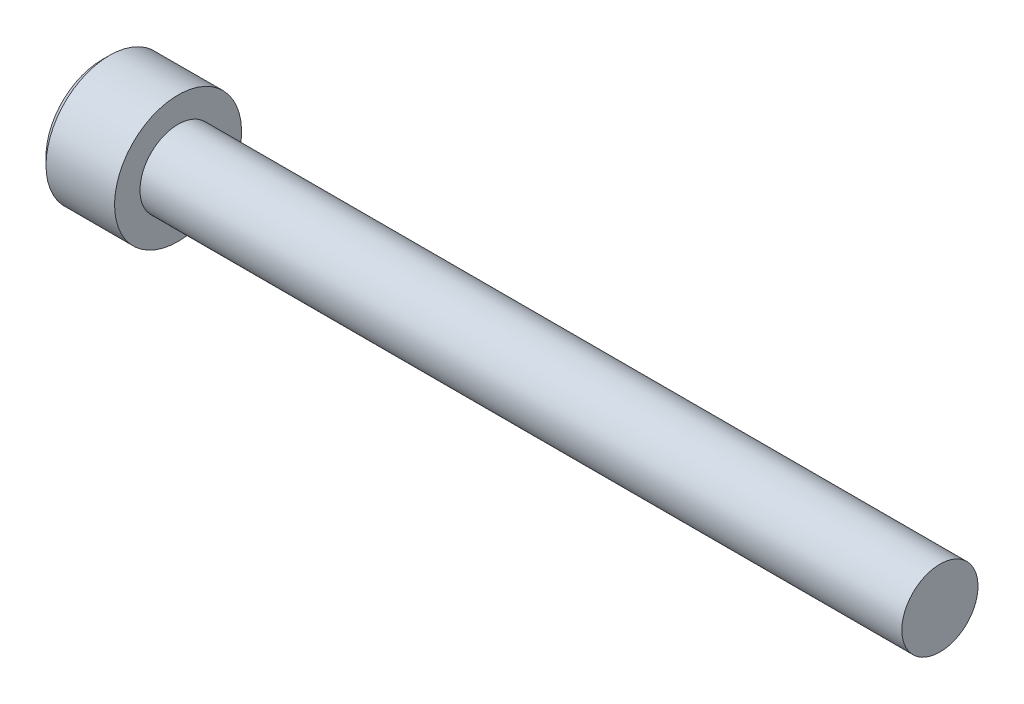
ISO-10303-21;
HEADER;
FILE_DESCRIPTION(('STEP AP214'),'2;1');
FILE_NAME('part.step','',(''),(''),'','','');
FILE_SCHEMA(('AUTOMOTIVE_DESIGN { 1 0 10303 214 1 1 1 1 }'));
ENDSEC;
DATA;
#1=APPLICATION_CONTEXT('core data for automotive mechanical design processes');
#2=APPLICATION_PROTOCOL_DEFINITION('international standard','automotive_design',2000,#1);
#3=PRODUCT_CONTEXT('',#1,'mechanical');
#4=PRODUCT('Part','Part','',(#3));
#5=PRODUCT_RELATED_PRODUCT_CATEGORY('part','',(#4));
#6=PRODUCT_DEFINITION_FORMATION('','',#4);
#7=PRODUCT_DEFINITION_CONTEXT('part definition',#1,'design');
#8=PRODUCT_DEFINITION('design','',#6,#7);
#9=PRODUCT_DEFINITION_SHAPE('','',#8);
#10=(LENGTH_UNIT() NAMED_UNIT(*) SI_UNIT(.MILLI.,.METRE.));
#11=(NAMED_UNIT(*) PLANE_ANGLE_UNIT() SI_UNIT($,.RADIAN.));
#12=(NAMED_UNIT(*) SI_UNIT($,.STERADIAN.) SOLID_ANGLE_UNIT());
#13=UNCERTAINTY_MEASURE_WITH_UNIT(LENGTH_MEASURE(1.E-05),#10,'distance_accuracy_value','');
#14=(GEOMETRIC_REPRESENTATION_CONTEXT(3) GLOBAL_UNCERTAINTY_ASSIGNED_CONTEXT((#13)) GLOBAL_UNIT_ASSIGNED_CONTEXT((#10,
#11,#12)) REPRESENTATION_CONTEXT('',''));
#15=CARTESIAN_POINT('',(0.,0.,0.));
#16=DIRECTION('',(0.,0.,1.));
#17=DIRECTION('',(1.,0.,0.));
#18=AXIS2_PLACEMENT_3D('',#15,#16,#17);
#19=CARTESIAN_POINT('',(-6.,0.,0.));
#20=DIRECTION('',(1.,0.,0.));
#21=DIRECTION('',(0.,1.,0.));
#22=AXIS2_PLACEMENT_3D('',#19,#20,#21);
#23=PLANE('',#22);
#24=CARTESIAN_POINT('',(-6.,0.,0.));
#25=DIRECTION('',(1.,0.,0.));
#26=DIRECTION('',(0.,1.,0.));
#27=AXIS2_PLACEMENT_3D('',#24,#25,#26);
#28=CIRCLE('',#27,4.4);
#29=CARTESIAN_POINT('',(-6.,4.4,0.));
#30=VERTEX_POINT('',#29);
#31=EDGE_CURVE('E50',#30,#30,#28,.F.);
#32=ORIENTED_EDGE('',*,*,#31,.T.);
#33=EDGE_LOOP('',(#32));
#34=FACE_BOUND('',#33,.T.);
#35=DIRECTION('',(0.,-0.5,-0.866025403784439));
#36=VECTOR('',#35,1.);
#37=CARTESIAN_POINT('',(-6.,2.88675134594813,0.));
#38=LINE('',#37,#36);
#39=CARTESIAN_POINT('',(-6.,2.88675134594813,0.));
#40=VERTEX_POINT('',#39);
#41=CARTESIAN_POINT('',(-6.,1.44337567297406,-2.5));
#42=VERTEX_POINT('',#41);
#43=EDGE_CURVE('E156',#40,#42,#38,.T.);
#44=ORIENTED_EDGE('',*,*,#43,.F.);
#45=DIRECTION('',(0.,0.5,-0.866025403784439));
#46=VECTOR('',#45,1.);
#47=CARTESIAN_POINT('',(-6.,1.44337567297407,2.5));
#48=LINE('',#47,#46);
#49=CARTESIAN_POINT('',(-6.,1.44337567297407,2.5));
#50=VERTEX_POINT('',#49);
#51=EDGE_CURVE('E57',#50,#40,#48,.T.);
#52=ORIENTED_EDGE('',*,*,#51,.F.);
#53=DIRECTION('',(0.,1.,0.));
#54=VECTOR('',#53,1.);
#55=CARTESIAN_POINT('',(-6.,-1.44337567297407,2.5));
#56=LINE('',#55,#54);
#57=CARTESIAN_POINT('',(-6.,-1.44337567297407,2.5));
#58=VERTEX_POINT('',#57);
#59=EDGE_CURVE('E127',#58,#50,#56,.T.);
#60=ORIENTED_EDGE('',*,*,#59,.F.);
#61=DIRECTION('',(0.,0.5,0.866025403784439));
#62=VECTOR('',#61,1.);
#63=CARTESIAN_POINT('',(-6.,-2.88675134594813,0.));
#64=LINE('',#63,#62);
#65=CARTESIAN_POINT('',(-6.,-2.88675134594813,0.));
#66=VERTEX_POINT('',#65);
#67=EDGE_CURVE('E162',#66,#58,#64,.T.);
#68=ORIENTED_EDGE('',*,*,#67,.F.);
#69=DIRECTION('',(0.,-0.5,0.866025403784439));
#70=VECTOR('',#69,1.);
#71=CARTESIAN_POINT('',(-6.,-1.44337567297406,-2.5));
#72=LINE('',#71,#70);
#73=CARTESIAN_POINT('',(-6.,-1.44337567297406,-2.5));
#74=VERTEX_POINT('',#73);
#75=EDGE_CURVE('E160',#74,#66,#72,.T.);
#76=ORIENTED_EDGE('',*,*,#75,.F.);
#77=DIRECTION('',(0.,-1.,0.));
#78=VECTOR('',#77,1.);
#79=CARTESIAN_POINT('',(-6.,1.44337567297406,-2.5));
#80=LINE('',#79,#78);
#81=EDGE_CURVE('E158',#42,#74,#80,.T.);
#82=ORIENTED_EDGE('',*,*,#81,.F.);
#83=EDGE_LOOP('',(#44,#52,#60,#68,#76,#82));
#84=FACE_BOUND('',#83,.T.);
#85=ADVANCED_FACE('F42',(#34,#84),#23,.F.);
#86=CARTESIAN_POINT('',(-6.,0.,0.));
#87=DIRECTION('',(-1.,0.,0.));
#88=DIRECTION('',(0.,-1.,0.));
#89=AXIS2_PLACEMENT_3D('',#86,#87,#88);
#90=CYLINDRICAL_SURFACE('',#89,5.);
#91=CARTESIAN_POINT('',(-5.4,0.,0.));
#92=DIRECTION('',(1.,0.,0.));
#93=DIRECTION('',(0.,1.,0.));
#94=AXIS2_PLACEMENT_3D('',#91,#92,#93);
#95=CIRCLE('',#94,5.);
#96=CARTESIAN_POINT('',(-5.4,5.,0.));
#97=VERTEX_POINT('',#96);
#98=EDGE_CURVE('E11',#97,#97,#95,.T.);
#99=ORIENTED_EDGE('',*,*,#98,.T.);
#100=EDGE_LOOP('',(#99));
#101=FACE_BOUND('',#100,.T.);
#102=CARTESIAN_POINT('',(0.,0.,0.));
#103=DIRECTION('',(-1.,0.,0.));
#104=DIRECTION('',(0.,-1.,0.));
#105=AXIS2_PLACEMENT_3D('',#102,#103,#104);
#106=CIRCLE('',#105,5.);
#107=CARTESIAN_POINT('',(0.,-5.,0.));
#108=VERTEX_POINT('',#107);
#109=EDGE_CURVE('E190',#108,#108,#106,.T.);
#110=ORIENTED_EDGE('',*,*,#109,.T.);
#111=EDGE_LOOP('',(#110));
#112=FACE_BOUND('',#111,.T.);
#113=ADVANCED_FACE('F211',(#101,#112),#90,.T.);
#114=CARTESIAN_POINT('',(0.,5.,0.));
#115=DIRECTION('',(-1.,0.,0.));
#116=DIRECTION('',(0.,-1.,0.));
#117=AXIS2_PLACEMENT_3D('',#114,#115,#116);
#118=PLANE('',#117);
#119=ORIENTED_EDGE('',*,*,#109,.F.);
#120=EDGE_LOOP('',(#119));
#121=FACE_BOUND('',#120,.T.);
#122=CARTESIAN_POINT('',(0.,0.,0.));
#123=DIRECTION('',(-1.,0.,0.));
#124=DIRECTION('',(0.,-1.,0.));
#125=AXIS2_PLACEMENT_3D('',#122,#123,#124);
#126=CIRCLE('',#125,3.);
#127=CARTESIAN_POINT('',(0.,-3.,0.));
#128=VERTEX_POINT('',#127);
#129=EDGE_CURVE('E187',#128,#128,#126,.T.);
#130=ORIENTED_EDGE('',*,*,#129,.T.);
#131=EDGE_LOOP('',(#130));
#132=FACE_BOUND('',#131,.T.);
#133=ADVANCED_FACE('F215',(#121,#132),#118,.F.);
#134=CARTESIAN_POINT('',(-6.,0.,0.));
#135=DIRECTION('',(-1.,0.,0.));
#136=DIRECTION('',(0.,-1.,0.));
#137=AXIS2_PLACEMENT_3D('',#134,#135,#136);
#138=CYLINDRICAL_SURFACE('',#137,3.);
#139=ORIENTED_EDGE('',*,*,#129,.F.);
#140=EDGE_LOOP('',(#139));
#141=FACE_BOUND('',#140,.T.);
#142=CARTESIAN_POINT('',(60.,0.,0.));
#143=DIRECTION('',(-1.,0.,0.));
#144=DIRECTION('',(0.,-1.,0.));
#145=AXIS2_PLACEMENT_3D('',#142,#143,#144);
#146=CIRCLE('',#145,3.);
#147=CARTESIAN_POINT('',(60.,-2.99999999999999,0.));
#148=VERTEX_POINT('',#147);
#149=EDGE_CURVE('E183',#148,#148,#146,.T.);
#150=ORIENTED_EDGE('',*,*,#149,.T.);
#151=EDGE_LOOP('',(#150));
#152=FACE_BOUND('',#151,.T.);
#153=ADVANCED_FACE('F206',(#141,#152),#138,.T.);
#154=CARTESIAN_POINT('',(60.,3.,0.));
#155=DIRECTION('',(-1.,0.,0.));
#156=DIRECTION('',(0.,-1.,0.));
#157=AXIS2_PLACEMENT_3D('',#154,#155,#156);
#158=PLANE('',#157);
#159=ORIENTED_EDGE('',*,*,#149,.F.);
#160=EDGE_LOOP('',(#159));
#161=FACE_BOUND('',#160,.T.);
#162=ADVANCED_FACE('F198',(#161),#158,.F.);
#163=CARTESIAN_POINT('',(-6.,0.,0.));
#164=DIRECTION('',(1.,0.,0.));
#165=DIRECTION('',(0.,1.,0.));
#166=AXIS2_PLACEMENT_3D('',#163,#164,#165);
#167=CONICAL_SURFACE('',#166,4.4,0.785398163397446);
#168=ORIENTED_EDGE('',*,*,#98,.F.);
#169=EDGE_LOOP('',(#168));
#170=FACE_BOUND('',#169,.T.);
#171=ORIENTED_EDGE('',*,*,#31,.F.);
#172=EDGE_LOOP('',(#171));
#173=FACE_BOUND('',#172,.T.);
#174=ADVANCED_FACE('F44',(#170,#173),#167,.T.);
#175=CARTESIAN_POINT('',(-3.,1.44337567297407,2.5));
#176=DIRECTION('',(0.,0.866025403784439,0.5));
#177=DIRECTION('',(0.,-0.5,0.866025403784439));
#178=AXIS2_PLACEMENT_3D('',#175,#176,#177);
#179=PLANE('',#178);
#180=DIRECTION('',(0.,0.5,-0.866025403784439));
#181=VECTOR('',#180,1.);
#182=CARTESIAN_POINT('',(-3.,1.44337567297407,2.5));
#183=LINE('',#182,#181);
#184=CARTESIAN_POINT('',(-3.,1.44337567297407,2.5));
#185=VERTEX_POINT('',#184);
#186=CARTESIAN_POINT('',(-3.,2.1650635094611,1.25));
#187=VERTEX_POINT('',#186);
#188=EDGE_CURVE('E126',#185,#187,#183,.T.);
#189=ORIENTED_EDGE('',*,*,#188,.F.);
#190=DIRECTION('',(-1.,0.,0.));
#191=VECTOR('',#190,1.);
#192=CARTESIAN_POINT('',(-3.,1.44337567297407,2.5));
#193=LINE('',#192,#191);
#194=EDGE_CURVE('E166',#185,#50,#193,.T.);
#195=ORIENTED_EDGE('',*,*,#194,.T.);
#196=ORIENTED_EDGE('',*,*,#51,.T.);
#197=DIRECTION('',(-1.,0.,0.));
#198=VECTOR('',#197,1.);
#199=CARTESIAN_POINT('',(-3.,2.88675134594813,0.));
#200=LINE('',#199,#198);
#201=CARTESIAN_POINT('',(-3.,2.88675134594813,0.));
#202=VERTEX_POINT('',#201);
#203=EDGE_CURVE('E129',#202,#40,#200,.T.);
#204=ORIENTED_EDGE('',*,*,#203,.F.);
#205=EDGE_CURVE('E118',#187,#202,#183,.T.);
#206=ORIENTED_EDGE('',*,*,#205,.F.);
#207=EDGE_LOOP('',(#189,#195,#196,#204,#206));
#208=FACE_BOUND('',#207,.T.);
#209=ADVANCED_FACE('F130',(#208),#179,.F.);
#210=CARTESIAN_POINT('',(-3.,-1.44337567297407,2.5));
#211=DIRECTION('',(0.,0.,1.));
#212=DIRECTION('',(0.,-1.,0.));
#213=AXIS2_PLACEMENT_3D('',#210,#211,#212);
#214=PLANE('',#213);
#215=DIRECTION('',(0.,1.,0.));
#216=VECTOR('',#215,1.);
#217=CARTESIAN_POINT('',(-3.,-1.44337567297407,2.5));
#218=LINE('',#217,#216);
#219=CARTESIAN_POINT('',(-3.,-1.44337567297407,2.5));
#220=VERTEX_POINT('',#219);
#221=CARTESIAN_POINT('',(-3.,0.,2.5));
#222=VERTEX_POINT('',#221);
#223=EDGE_CURVE('E65',#220,#222,#218,.T.);
#224=ORIENTED_EDGE('',*,*,#223,.F.);
#225=DIRECTION('',(-1.,0.,0.));
#226=VECTOR('',#225,1.);
#227=CARTESIAN_POINT('',(-3.,-1.44337567297407,2.5));
#228=LINE('',#227,#226);
#229=EDGE_CURVE('E169',#220,#58,#228,.T.);
#230=ORIENTED_EDGE('',*,*,#229,.T.);
#231=ORIENTED_EDGE('',*,*,#59,.T.);
#232=ORIENTED_EDGE('',*,*,#194,.F.);
#233=EDGE_CURVE('E153',#222,#185,#218,.T.);
#234=ORIENTED_EDGE('',*,*,#233,.F.);
#235=EDGE_LOOP('',(#224,#230,#231,#232,#234));
#236=FACE_BOUND('',#235,.T.);
#237=ADVANCED_FACE('F204',(#236),#214,.F.);
#238=CARTESIAN_POINT('',(-3.,-2.88675134594813,0.));
#239=DIRECTION('',(0.,-0.866025403784439,0.5));
#240=DIRECTION('',(0.,-0.5,-0.866025403784439));
#241=AXIS2_PLACEMENT_3D('',#238,#239,#240);
#242=PLANE('',#241);
#243=DIRECTION('',(0.,0.5,0.866025403784439));
#244=VECTOR('',#243,1.);
#245=CARTESIAN_POINT('',(-3.,-2.88675134594813,0.));
#246=LINE('',#245,#244);
#247=CARTESIAN_POINT('',(-3.,-2.88675134594813,0.));
#248=VERTEX_POINT('',#247);
#249=CARTESIAN_POINT('',(-3.,-2.1650635094611,1.25));
#250=VERTEX_POINT('',#249);
#251=EDGE_CURVE('E150',#248,#250,#246,.T.);
#252=ORIENTED_EDGE('',*,*,#251,.F.);
#253=DIRECTION('',(-1.,0.,0.));
#254=VECTOR('',#253,1.);
#255=CARTESIAN_POINT('',(-3.,-2.88675134594813,0.));
#256=LINE('',#255,#254);
#257=EDGE_CURVE('E172',#248,#66,#256,.T.);
#258=ORIENTED_EDGE('',*,*,#257,.T.);
#259=ORIENTED_EDGE('',*,*,#67,.T.);
#260=ORIENTED_EDGE('',*,*,#229,.F.);
#261=EDGE_CURVE('E149',#250,#220,#246,.T.);
#262=ORIENTED_EDGE('',*,*,#261,.F.);
#263=EDGE_LOOP('',(#252,#258,#259,#260,#262));
#264=FACE_BOUND('',#263,.T.);
#265=ADVANCED_FACE('F240',(#264),#242,.F.);
#266=CARTESIAN_POINT('',(-3.,-1.44337567297406,-2.5));
#267=DIRECTION('',(0.,-0.866025403784439,-0.5));
#268=DIRECTION('',(0.,0.5,-0.866025403784439));
#269=AXIS2_PLACEMENT_3D('',#266,#267,#268);
#270=PLANE('',#269);
#271=DIRECTION('',(0.,-0.5,0.866025403784439));
#272=VECTOR('',#271,1.);
#273=CARTESIAN_POINT('',(-3.,-1.44337567297406,-2.5));
#274=LINE('',#273,#272);
#275=CARTESIAN_POINT('',(-3.,-1.44337567297406,-2.5));
#276=VERTEX_POINT('',#275);
#277=CARTESIAN_POINT('',(-3.,-2.1650635094611,-1.25));
#278=VERTEX_POINT('',#277);
#279=EDGE_CURVE('E146',#276,#278,#274,.T.);
#280=ORIENTED_EDGE('',*,*,#279,.F.);
#281=DIRECTION('',(-1.,0.,0.));
#282=VECTOR('',#281,1.);
#283=CARTESIAN_POINT('',(-3.,-1.44337567297406,-2.5));
#284=LINE('',#283,#282);
#285=EDGE_CURVE('E175',#276,#74,#284,.T.);
#286=ORIENTED_EDGE('',*,*,#285,.T.);
#287=ORIENTED_EDGE('',*,*,#75,.T.);
#288=ORIENTED_EDGE('',*,*,#257,.F.);
#289=EDGE_CURVE('E145',#278,#248,#274,.T.);
#290=ORIENTED_EDGE('',*,*,#289,.F.);
#291=EDGE_LOOP('',(#280,#286,#287,#288,#290));
#292=FACE_BOUND('',#291,.T.);
#293=ADVANCED_FACE('F236',(#292),#270,.F.);
#294=CARTESIAN_POINT('',(-3.,1.44337567297406,-2.5));
#295=DIRECTION('',(0.,0.,-1.));
#296=DIRECTION('',(-1.,0.,0.));
#297=AXIS2_PLACEMENT_3D('',#294,#295,#296);
#298=PLANE('',#297);
#299=DIRECTION('',(0.,-1.,0.));
#300=VECTOR('',#299,1.);
#301=CARTESIAN_POINT('',(-3.,1.44337567297406,-2.5));
#302=LINE('',#301,#300);
#303=CARTESIAN_POINT('',(-3.,1.44337567297406,-2.5));
#304=VERTEX_POINT('',#303);
#305=CARTESIAN_POINT('',(-3.,0.,-2.5));
#306=VERTEX_POINT('',#305);
#307=EDGE_CURVE('E141',#304,#306,#302,.T.);
#308=ORIENTED_EDGE('',*,*,#307,.F.);
#309=DIRECTION('',(-1.,0.,0.));
#310=VECTOR('',#309,1.);
#311=CARTESIAN_POINT('',(-3.,1.44337567297406,-2.5));
#312=LINE('',#311,#310);
#313=EDGE_CURVE('E133',#304,#42,#312,.T.);
#314=ORIENTED_EDGE('',*,*,#313,.T.);
#315=ORIENTED_EDGE('',*,*,#81,.T.);
#316=ORIENTED_EDGE('',*,*,#285,.F.);
#317=EDGE_CURVE('E139',#306,#276,#302,.T.);
#318=ORIENTED_EDGE('',*,*,#317,.F.);
#319=EDGE_LOOP('',(#308,#314,#315,#316,#318));
#320=FACE_BOUND('',#319,.T.);
#321=ADVANCED_FACE('F233',(#320),#298,.F.);
#322=CARTESIAN_POINT('',(-3.,2.88675134594813,0.));
#323=DIRECTION('',(0.,0.866025403784439,-0.5));
#324=DIRECTION('',(0.,0.5,0.866025403784439));
#325=AXIS2_PLACEMENT_3D('',#322,#323,#324);
#326=PLANE('',#325);
#327=DIRECTION('',(0.,-0.5,-0.866025403784439));
#328=VECTOR('',#327,1.);
#329=CARTESIAN_POINT('',(-3.,2.88675134594813,0.));
#330=LINE('',#329,#328);
#331=CARTESIAN_POINT('',(-3.,2.1650635094611,-1.25));
#332=VERTEX_POINT('',#331);
#333=EDGE_CURVE('E121',#202,#332,#330,.T.);
#334=ORIENTED_EDGE('',*,*,#333,.F.);
#335=ORIENTED_EDGE('',*,*,#203,.T.);
#336=ORIENTED_EDGE('',*,*,#43,.T.);
#337=ORIENTED_EDGE('',*,*,#313,.F.);
#338=EDGE_CURVE('E138',#332,#304,#330,.T.);
#339=ORIENTED_EDGE('',*,*,#338,.F.);
#340=EDGE_LOOP('',(#334,#335,#336,#337,#339));
#341=FACE_BOUND('',#340,.T.);
#342=ADVANCED_FACE('F136',(#341),#326,.F.);
#343=CARTESIAN_POINT('',(-3.,0.,0.));
#344=DIRECTION('',(-1.,0.,0.));
#345=DIRECTION('',(0.,0.,1.));
#346=AXIS2_PLACEMENT_3D('',#343,#344,#345);
#347=PLANE('',#346);
#348=ORIENTED_EDGE('',*,*,#233,.T.);
#349=ORIENTED_EDGE('',*,*,#188,.T.);
#350=CARTESIAN_POINT('',(-3.,0.,0.));
#351=DIRECTION('',(-1.,0.,0.));
#352=DIRECTION('',(0.,-1.,0.));
#353=AXIS2_PLACEMENT_3D('',#350,#351,#352);
#354=CIRCLE('',#353,2.5);
#355=EDGE_CURVE('E184',#222,#187,#354,.T.);
#356=ORIENTED_EDGE('',*,*,#355,.F.);
#357=EDGE_LOOP('',(#348,#349,#356));
#358=FACE_BOUND('',#357,.T.);
#359=ADVANCED_FACE('F232',(#358),#347,.T.);
#360=ORIENTED_EDGE('',*,*,#205,.T.);
#361=ORIENTED_EDGE('',*,*,#333,.T.);
#362=EDGE_CURVE('E123',#187,#332,#354,.T.);
#363=ORIENTED_EDGE('',*,*,#362,.F.);
#364=EDGE_LOOP('',(#360,#361,#363));
#365=FACE_BOUND('',#364,.T.);
#366=ADVANCED_FACE('F119',(#365),#347,.T.);
#367=ORIENTED_EDGE('',*,*,#338,.T.);
#368=ORIENTED_EDGE('',*,*,#307,.T.);
#369=EDGE_CURVE('E272',#332,#306,#354,.T.);
#370=ORIENTED_EDGE('',*,*,#369,.F.);
#371=EDGE_LOOP('',(#367,#368,#370));
#372=FACE_BOUND('',#371,.T.);
#373=ADVANCED_FACE('F260',(#372),#347,.T.);
#374=ORIENTED_EDGE('',*,*,#317,.T.);
#375=ORIENTED_EDGE('',*,*,#279,.T.);
#376=EDGE_CURVE('E276',#306,#278,#354,.T.);
#377=ORIENTED_EDGE('',*,*,#376,.F.);
#378=EDGE_LOOP('',(#374,#375,#377));
#379=FACE_BOUND('',#378,.T.);
#380=ADVANCED_FACE('F253',(#379),#347,.T.);
#381=ORIENTED_EDGE('',*,*,#289,.T.);
#382=ORIENTED_EDGE('',*,*,#251,.T.);
#383=EDGE_CURVE('E168',#278,#250,#354,.T.);
#384=ORIENTED_EDGE('',*,*,#383,.F.);
#385=EDGE_LOOP('',(#381,#382,#384));
#386=FACE_BOUND('',#385,.T.);
#387=ADVANCED_FACE('F249',(#386),#347,.T.);
#388=ORIENTED_EDGE('',*,*,#261,.T.);
#389=ORIENTED_EDGE('',*,*,#223,.T.);
#390=EDGE_CURVE('E180',#250,#222,#354,.T.);
#391=ORIENTED_EDGE('',*,*,#390,.F.);
#392=EDGE_LOOP('',(#388,#389,#391));
#393=FACE_BOUND('',#392,.T.);
#394=ADVANCED_FACE('F227',(#393),#347,.T.);
#395=CARTESIAN_POINT('',(-1.49784845243108,0.,0.));
#396=DIRECTION('',(-1.,0.,0.));
#397=DIRECTION('',(0.,-1.,0.));
#398=AXIS2_PLACEMENT_3D('',#395,#396,#397);
#399=CONICAL_SURFACE('',#398,0.,1.02974425867665);
#400=ORIENTED_EDGE('',*,*,#390,.T.);
#401=ORIENTED_EDGE('',*,*,#355,.T.);
#402=ORIENTED_EDGE('',*,*,#362,.T.);
#403=ORIENTED_EDGE('',*,*,#369,.T.);
#404=ORIENTED_EDGE('',*,*,#376,.T.);
#405=ORIENTED_EDGE('',*,*,#383,.T.);
#406=EDGE_LOOP('',(#400,#401,#402,#403,#404,#405));
#407=FACE_BOUND('',#406,.T.);
#408=CARTESIAN_POINT('',(-1.49784845243108,0.,0.));
#409=VERTEX_POINT('',#408);
#410=VERTEX_LOOP('',#409);
#411=FACE_BOUND('',#410,.T.);
#412=ADVANCED_FACE('F225',(#407,#411),#399,.F.);
#413=CLOSED_SHELL('',(#85,#113,#133,#153,#162,#174,#209,#237,#265,#293,#321,#342,#359,#366,#373,
#380,#387,#394,#412));
#414=MANIFOLD_SOLID_BREP('B2',#413);
#415=ADVANCED_BREP_SHAPE_REPRESENTATION('',(#18,#414),#14);
#416=SHAPE_DEFINITION_REPRESENTATION(#9,#415);
ENDSEC;
END-ISO-10303-21;
